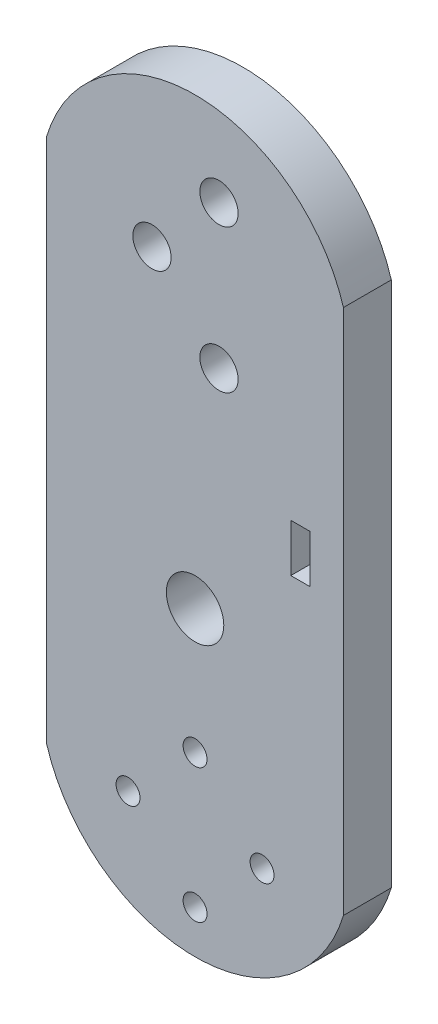
ISO-10303-21;
HEADER;
FILE_DESCRIPTION(('STEP AP214'),'2;1');
FILE_NAME('part.step','',(''),(''),'','','');
FILE_SCHEMA(('AUTOMOTIVE_DESIGN { 1 0 10303 214 1 1 1 1 }'));
ENDSEC;
DATA;
#1=APPLICATION_CONTEXT('core data for automotive mechanical design processes');
#2=APPLICATION_PROTOCOL_DEFINITION('international standard','automotive_design',2000,#1);
#3=PRODUCT_CONTEXT('',#1,'mechanical');
#4=PRODUCT('Part','Part','',(#3));
#5=PRODUCT_RELATED_PRODUCT_CATEGORY('part','',(#4));
#6=PRODUCT_DEFINITION_FORMATION('','',#4);
#7=PRODUCT_DEFINITION_CONTEXT('part definition',#1,'design');
#8=PRODUCT_DEFINITION('design','',#6,#7);
#9=PRODUCT_DEFINITION_SHAPE('','',#8);
#10=(LENGTH_UNIT() NAMED_UNIT(*) SI_UNIT(.MILLI.,.METRE.));
#11=(NAMED_UNIT(*) PLANE_ANGLE_UNIT() SI_UNIT($,.RADIAN.));
#12=(NAMED_UNIT(*) SI_UNIT($,.STERADIAN.) SOLID_ANGLE_UNIT());
#13=UNCERTAINTY_MEASURE_WITH_UNIT(LENGTH_MEASURE(1.E-05),#10,'distance_accuracy_value','');
#14=(GEOMETRIC_REPRESENTATION_CONTEXT(3) GLOBAL_UNCERTAINTY_ASSIGNED_CONTEXT((#13)) GLOBAL_UNIT_ASSIGNED_CONTEXT((#10,
#11,#12)) REPRESENTATION_CONTEXT('',''));
#15=CARTESIAN_POINT('',(0.,0.,0.));
#16=DIRECTION('',(0.,0.,1.));
#17=DIRECTION('',(1.,0.,0.));
#18=AXIS2_PLACEMENT_3D('',#15,#16,#17);
#19=CARTESIAN_POINT('',(0.,4.69565217391304,5.));
#20=DIRECTION('',(0.,0.,1.));
#21=DIRECTION('',(1.,0.,0.));
#22=AXIS2_PLACEMENT_3D('',#19,#20,#21);
#23=PLANE('',#22);
#24=CARTESIAN_POINT('',(2.49999999999999,43.,5.));
#25=DIRECTION('',(0.,0.,1.));
#26=DIRECTION('',(1.,0.,0.));
#27=AXIS2_PLACEMENT_3D('',#24,#25,#26);
#28=CIRCLE('',#27,2.);
#29=CARTESIAN_POINT('',(4.5,43.,5.));
#30=VERTEX_POINT('',#29);
#31=EDGE_CURVE('E169',#30,#30,#28,.T.);
#32=ORIENTED_EDGE('',*,*,#31,.F.);
#33=EDGE_LOOP('',(#32));
#34=FACE_BOUND('',#33,.T.);
#35=CARTESIAN_POINT('',(0.,20.,5.));
#36=DIRECTION('',(0.,0.,1.));
#37=DIRECTION('',(1.,0.,0.));
#38=AXIS2_PLACEMENT_3D('',#35,#36,#37);
#39=CIRCLE('',#38,3.);
#40=CARTESIAN_POINT('',(3.,20.,5.));
#41=VERTEX_POINT('',#40);
#42=EDGE_CURVE('E185',#41,#41,#39,.T.);
#43=ORIENTED_EDGE('',*,*,#42,.F.);
#44=EDGE_LOOP('',(#43));
#45=FACE_BOUND('',#44,.T.);
#46=CARTESIAN_POINT('',(0.,-7.,5.));
#47=DIRECTION('',(0.,0.,1.));
#48=DIRECTION('',(1.,0.,0.));
#49=AXIS2_PLACEMENT_3D('',#46,#47,#48);
#50=CIRCLE('',#49,1.25);
#51=CARTESIAN_POINT('',(1.25,-7.,5.));
#52=VERTEX_POINT('',#51);
#53=EDGE_CURVE('E201',#52,#52,#50,.T.);
#54=ORIENTED_EDGE('',*,*,#53,.F.);
#55=EDGE_LOOP('',(#54));
#56=FACE_BOUND('',#55,.T.);
#57=CARTESIAN_POINT('',(0.,7.,5.));
#58=DIRECTION('',(0.,0.,1.));
#59=DIRECTION('',(1.,0.,0.));
#60=AXIS2_PLACEMENT_3D('',#57,#58,#59);
#61=CIRCLE('',#60,1.25);
#62=CARTESIAN_POINT('',(1.25,7.,5.));
#63=VERTEX_POINT('',#62);
#64=EDGE_CURVE('E217',#63,#63,#61,.T.);
#65=ORIENTED_EDGE('',*,*,#64,.F.);
#66=EDGE_LOOP('',(#65));
#67=FACE_BOUND('',#66,.T.);
#68=CARTESIAN_POINT('',(0.,4.69565217391304,5.));
#69=DIRECTION('',(0.,0.,1.));
#70=DIRECTION('',(1.,0.,0.));
#71=AXIS2_PLACEMENT_3D('',#68,#69,#70);
#72=CIRCLE('',#71,16.195652173913);
#73=CARTESIAN_POINT('',(-15.5,0.,5.));
#74=VERTEX_POINT('',#73);
#75=CARTESIAN_POINT('',(15.5,0.,5.));
#76=VERTEX_POINT('',#75);
#77=EDGE_CURVE('E225',#74,#76,#72,.T.);
#78=ORIENTED_EDGE('',*,*,#77,.T.);
#79=DIRECTION('',(0.,1.,0.));
#80=VECTOR('',#79,1.);
#81=CARTESIAN_POINT('',(15.5,55.,5.));
#82=LINE('',#81,#80);
#83=CARTESIAN_POINT('',(15.5,55.,5.));
#84=VERTEX_POINT('',#83);
#85=EDGE_CURVE('E229',#76,#84,#82,.T.);
#86=ORIENTED_EDGE('',*,*,#85,.T.);
#87=CARTESIAN_POINT('',(0.,50.304347826087,5.));
#88=DIRECTION('',(0.,0.,1.));
#89=DIRECTION('',(-1.,0.,0.));
#90=AXIS2_PLACEMENT_3D('',#87,#88,#89);
#91=CIRCLE('',#90,16.195652173913);
#92=CARTESIAN_POINT('',(-15.5,55.,5.));
#93=VERTEX_POINT('',#92);
#94=EDGE_CURVE('E233',#84,#93,#91,.T.);
#95=ORIENTED_EDGE('',*,*,#94,.T.);
#96=DIRECTION('',(0.,-1.,0.));
#97=VECTOR('',#96,1.);
#98=CARTESIAN_POINT('',(-15.5,55.,5.));
#99=LINE('',#98,#97);
#100=EDGE_CURVE('E236',#93,#74,#99,.T.);
#101=ORIENTED_EDGE('',*,*,#100,.T.);
#102=EDGE_LOOP('',(#78,#86,#95,#101));
#103=FACE_BOUND('',#102,.T.);
#104=CARTESIAN_POINT('',(7.,0.,5.));
#105=DIRECTION('',(0.,0.,1.));
#106=DIRECTION('',(1.,0.,0.));
#107=AXIS2_PLACEMENT_3D('',#104,#105,#106);
#108=CIRCLE('',#107,1.25);
#109=CARTESIAN_POINT('',(8.25,0.,5.));
#110=VERTEX_POINT('',#109);
#111=EDGE_CURVE('E209',#110,#110,#108,.T.);
#112=ORIENTED_EDGE('',*,*,#111,.F.);
#113=EDGE_LOOP('',(#112));
#114=FACE_BOUND('',#113,.T.);
#115=CARTESIAN_POINT('',(-7.,0.,5.));
#116=DIRECTION('',(0.,0.,1.));
#117=DIRECTION('',(1.,0.,0.));
#118=AXIS2_PLACEMENT_3D('',#115,#116,#117);
#119=CIRCLE('',#118,1.25);
#120=CARTESIAN_POINT('',(-5.75,0.,5.));
#121=VERTEX_POINT('',#120);
#122=EDGE_CURVE('E193',#121,#121,#119,.T.);
#123=ORIENTED_EDGE('',*,*,#122,.F.);
#124=EDGE_LOOP('',(#123));
#125=FACE_BOUND('',#124,.T.);
#126=CARTESIAN_POINT('',(2.49999999999999,58.,5.));
#127=DIRECTION('',(0.,0.,1.));
#128=DIRECTION('',(1.,0.,0.));
#129=AXIS2_PLACEMENT_3D('',#126,#127,#128);
#130=CIRCLE('',#129,2.);
#131=CARTESIAN_POINT('',(4.5,58.,5.));
#132=VERTEX_POINT('',#131);
#133=EDGE_CURVE('E177',#132,#132,#130,.T.);
#134=ORIENTED_EDGE('',*,*,#133,.F.);
#135=EDGE_LOOP('',(#134));
#136=FACE_BOUND('',#135,.T.);
#137=CARTESIAN_POINT('',(-4.50000000000001,50.5,5.));
#138=DIRECTION('',(0.,0.,1.));
#139=DIRECTION('',(1.,0.,0.));
#140=AXIS2_PLACEMENT_3D('',#137,#138,#139);
#141=CIRCLE('',#140,2.);
#142=CARTESIAN_POINT('',(-2.5,50.5,5.));
#143=VERTEX_POINT('',#142);
#144=EDGE_CURVE('E161',#143,#143,#141,.T.);
#145=ORIENTED_EDGE('',*,*,#144,.F.);
#146=EDGE_LOOP('',(#145));
#147=FACE_BOUND('',#146,.T.);
#148=DIRECTION('',(1.,0.,0.));
#149=VECTOR('',#148,1.);
#150=CARTESIAN_POINT('',(9.99999999999999,28.,5.));
#151=LINE('',#150,#149);
#152=CARTESIAN_POINT('',(9.99999999999999,28.,5.));
#153=VERTEX_POINT('',#152);
#154=CARTESIAN_POINT('',(12.,28.,5.));
#155=VERTEX_POINT('',#154);
#156=EDGE_CURVE('E120',#153,#155,#151,.T.);
#157=ORIENTED_EDGE('',*,*,#156,.F.);
#158=DIRECTION('',(0.,-1.,0.));
#159=VECTOR('',#158,1.);
#160=CARTESIAN_POINT('',(9.99999999999999,33.,5.));
#161=LINE('',#160,#159);
#162=CARTESIAN_POINT('',(9.99999999999999,33.,5.));
#163=VERTEX_POINT('',#162);
#164=EDGE_CURVE('E111',#163,#153,#161,.T.);
#165=ORIENTED_EDGE('',*,*,#164,.F.);
#166=DIRECTION('',(-1.,0.,0.));
#167=VECTOR('',#166,1.);
#168=CARTESIAN_POINT('',(9.99999999999999,33.,5.));
#169=LINE('',#168,#167);
#170=CARTESIAN_POINT('',(12.,33.,5.));
#171=VERTEX_POINT('',#170);
#172=EDGE_CURVE('E139',#171,#163,#169,.T.);
#173=ORIENTED_EDGE('',*,*,#172,.F.);
#174=DIRECTION('',(0.,1.,0.));
#175=VECTOR('',#174,1.);
#176=CARTESIAN_POINT('',(12.,33.,5.));
#177=LINE('',#176,#175);
#178=EDGE_CURVE('E133',#155,#171,#177,.T.);
#179=ORIENTED_EDGE('',*,*,#178,.F.);
#180=EDGE_LOOP('',(#157,#165,#173,#179));
#181=FACE_BOUND('',#180,.T.);
#182=ADVANCED_FACE('F45',(#34,#45,#56,#67,#103,#114,#125,#136,#147,#181),#23,.T.);
#183=CARTESIAN_POINT('',(0.,4.69565217391304,0.));
#184=DIRECTION('',(0.,0.,1.));
#185=DIRECTION('',(1.,0.,0.));
#186=AXIS2_PLACEMENT_3D('',#183,#184,#185);
#187=PLANE('',#186);
#188=CARTESIAN_POINT('',(-4.50000000000001,50.5,0.));
#189=DIRECTION('',(0.,0.,1.));
#190=DIRECTION('',(1.,0.,0.));
#191=AXIS2_PLACEMENT_3D('',#188,#189,#190);
#192=CIRCLE('',#191,2.);
#193=CARTESIAN_POINT('',(-2.5,50.5,0.));
#194=VERTEX_POINT('',#193);
#195=EDGE_CURVE('E129',#194,#194,#192,.T.);
#196=ORIENTED_EDGE('',*,*,#195,.T.);
#197=EDGE_LOOP('',(#196));
#198=FACE_BOUND('',#197,.T.);
#199=CARTESIAN_POINT('',(2.49999999999999,43.,0.));
#200=DIRECTION('',(0.,0.,1.));
#201=DIRECTION('',(1.,0.,0.));
#202=AXIS2_PLACEMENT_3D('',#199,#200,#201);
#203=CIRCLE('',#202,2.);
#204=CARTESIAN_POINT('',(4.5,43.,0.));
#205=VERTEX_POINT('',#204);
#206=EDGE_CURVE('E165',#205,#205,#203,.T.);
#207=ORIENTED_EDGE('',*,*,#206,.T.);
#208=EDGE_LOOP('',(#207));
#209=FACE_BOUND('',#208,.T.);
#210=CARTESIAN_POINT('',(2.49999999999999,58.,0.));
#211=DIRECTION('',(0.,0.,1.));
#212=DIRECTION('',(1.,0.,0.));
#213=AXIS2_PLACEMENT_3D('',#210,#211,#212);
#214=CIRCLE('',#213,2.);
#215=CARTESIAN_POINT('',(4.5,58.,0.));
#216=VERTEX_POINT('',#215);
#217=EDGE_CURVE('E173',#216,#216,#214,.T.);
#218=ORIENTED_EDGE('',*,*,#217,.T.);
#219=EDGE_LOOP('',(#218));
#220=FACE_BOUND('',#219,.T.);
#221=CARTESIAN_POINT('',(0.,20.,0.));
#222=DIRECTION('',(0.,0.,1.));
#223=DIRECTION('',(1.,0.,0.));
#224=AXIS2_PLACEMENT_3D('',#221,#222,#223);
#225=CIRCLE('',#224,3.);
#226=CARTESIAN_POINT('',(3.,20.,0.));
#227=VERTEX_POINT('',#226);
#228=EDGE_CURVE('E181',#227,#227,#225,.T.);
#229=ORIENTED_EDGE('',*,*,#228,.T.);
#230=EDGE_LOOP('',(#229));
#231=FACE_BOUND('',#230,.T.);
#232=CARTESIAN_POINT('',(-7.,0.,0.));
#233=DIRECTION('',(0.,0.,1.));
#234=DIRECTION('',(1.,0.,0.));
#235=AXIS2_PLACEMENT_3D('',#232,#233,#234);
#236=CIRCLE('',#235,1.25);
#237=CARTESIAN_POINT('',(-5.75,0.,0.));
#238=VERTEX_POINT('',#237);
#239=EDGE_CURVE('E189',#238,#238,#236,.T.);
#240=ORIENTED_EDGE('',*,*,#239,.T.);
#241=EDGE_LOOP('',(#240));
#242=FACE_BOUND('',#241,.T.);
#243=CARTESIAN_POINT('',(0.,-7.,0.));
#244=DIRECTION('',(0.,0.,1.));
#245=DIRECTION('',(1.,0.,0.));
#246=AXIS2_PLACEMENT_3D('',#243,#244,#245);
#247=CIRCLE('',#246,1.25);
#248=CARTESIAN_POINT('',(1.25,-7.,0.));
#249=VERTEX_POINT('',#248);
#250=EDGE_CURVE('E197',#249,#249,#247,.T.);
#251=ORIENTED_EDGE('',*,*,#250,.T.);
#252=EDGE_LOOP('',(#251));
#253=FACE_BOUND('',#252,.T.);
#254=CARTESIAN_POINT('',(7.,0.,0.));
#255=DIRECTION('',(0.,0.,1.));
#256=DIRECTION('',(1.,0.,0.));
#257=AXIS2_PLACEMENT_3D('',#254,#255,#256);
#258=CIRCLE('',#257,1.25);
#259=CARTESIAN_POINT('',(8.25,0.,0.));
#260=VERTEX_POINT('',#259);
#261=EDGE_CURVE('E205',#260,#260,#258,.T.);
#262=ORIENTED_EDGE('',*,*,#261,.T.);
#263=EDGE_LOOP('',(#262));
#264=FACE_BOUND('',#263,.T.);
#265=CARTESIAN_POINT('',(0.,7.,0.));
#266=DIRECTION('',(0.,0.,1.));
#267=DIRECTION('',(1.,0.,0.));
#268=AXIS2_PLACEMENT_3D('',#265,#266,#267);
#269=CIRCLE('',#268,1.25);
#270=CARTESIAN_POINT('',(1.25,7.,0.));
#271=VERTEX_POINT('',#270);
#272=EDGE_CURVE('E213',#271,#271,#269,.T.);
#273=ORIENTED_EDGE('',*,*,#272,.T.);
#274=EDGE_LOOP('',(#273));
#275=FACE_BOUND('',#274,.T.);
#276=CARTESIAN_POINT('',(0.,4.69565217391304,0.));
#277=DIRECTION('',(0.,0.,1.));
#278=DIRECTION('',(1.,0.,0.));
#279=AXIS2_PLACEMENT_3D('',#276,#277,#278);
#280=CIRCLE('',#279,16.195652173913);
#281=CARTESIAN_POINT('',(-15.5,0.,0.));
#282=VERTEX_POINT('',#281);
#283=CARTESIAN_POINT('',(15.5,0.,0.));
#284=VERTEX_POINT('',#283);
#285=EDGE_CURVE('E221',#282,#284,#280,.T.);
#286=ORIENTED_EDGE('',*,*,#285,.F.);
#287=DIRECTION('',(0.,-1.,0.));
#288=VECTOR('',#287,1.);
#289=CARTESIAN_POINT('',(-15.5,55.,0.));
#290=LINE('',#289,#288);
#291=CARTESIAN_POINT('',(-15.5,55.,0.));
#292=VERTEX_POINT('',#291);
#293=EDGE_CURVE('E230',#292,#282,#290,.T.);
#294=ORIENTED_EDGE('',*,*,#293,.F.);
#295=CARTESIAN_POINT('',(0.,50.304347826087,0.));
#296=DIRECTION('',(0.,0.,1.));
#297=DIRECTION('',(-1.,0.,0.));
#298=AXIS2_PLACEMENT_3D('',#295,#296,#297);
#299=CIRCLE('',#298,16.195652173913);
#300=CARTESIAN_POINT('',(15.5,55.,0.));
#301=VERTEX_POINT('',#300);
#302=EDGE_CURVE('E246',#301,#292,#299,.T.);
#303=ORIENTED_EDGE('',*,*,#302,.F.);
#304=DIRECTION('',(0.,1.,0.));
#305=VECTOR('',#304,1.);
#306=CARTESIAN_POINT('',(15.5,55.,0.));
#307=LINE('',#306,#305);
#308=EDGE_CURVE('E243',#284,#301,#307,.T.);
#309=ORIENTED_EDGE('',*,*,#308,.F.);
#310=EDGE_LOOP('',(#286,#294,#303,#309));
#311=FACE_BOUND('',#310,.T.);
#312=DIRECTION('',(0.,-1.,0.));
#313=VECTOR('',#312,1.);
#314=CARTESIAN_POINT('',(9.99999999999999,33.,0.));
#315=LINE('',#314,#313);
#316=CARTESIAN_POINT('',(9.99999999999999,33.,0.));
#317=VERTEX_POINT('',#316);
#318=CARTESIAN_POINT('',(9.99999999999999,28.,0.));
#319=VERTEX_POINT('',#318);
#320=EDGE_CURVE('E69',#317,#319,#315,.T.);
#321=ORIENTED_EDGE('',*,*,#320,.T.);
#322=DIRECTION('',(1.,0.,0.));
#323=VECTOR('',#322,1.);
#324=CARTESIAN_POINT('',(9.99999999999999,28.,0.));
#325=LINE('',#324,#323);
#326=CARTESIAN_POINT('',(12.,28.,0.));
#327=VERTEX_POINT('',#326);
#328=EDGE_CURVE('E127',#319,#327,#325,.T.);
#329=ORIENTED_EDGE('',*,*,#328,.T.);
#330=DIRECTION('',(0.,1.,0.));
#331=VECTOR('',#330,1.);
#332=CARTESIAN_POINT('',(12.,33.,0.));
#333=LINE('',#332,#331);
#334=CARTESIAN_POINT('',(12.,33.,0.));
#335=VERTEX_POINT('',#334);
#336=EDGE_CURVE('E148',#327,#335,#333,.T.);
#337=ORIENTED_EDGE('',*,*,#336,.T.);
#338=DIRECTION('',(-1.,0.,0.));
#339=VECTOR('',#338,1.);
#340=CARTESIAN_POINT('',(9.99999999999999,33.,0.));
#341=LINE('',#340,#339);
#342=EDGE_CURVE('E121',#335,#317,#341,.T.);
#343=ORIENTED_EDGE('',*,*,#342,.T.);
#344=EDGE_LOOP('',(#321,#329,#337,#343));
#345=FACE_BOUND('',#344,.T.);
#346=ADVANCED_FACE('F271',(#198,#209,#220,#231,#242,#253,#264,#275,#311,#345),#187,.F.);
#347=CARTESIAN_POINT('',(0.,4.69565217391304,5.));
#348=DIRECTION('',(0.,0.,-1.));
#349=DIRECTION('',(-1.,0.,0.));
#350=AXIS2_PLACEMENT_3D('',#347,#348,#349);
#351=CYLINDRICAL_SURFACE('',#350,16.195652173913);
#352=ORIENTED_EDGE('',*,*,#285,.T.);
#353=DIRECTION('',(0.,0.,-1.));
#354=VECTOR('',#353,1.);
#355=CARTESIAN_POINT('',(15.5,0.,5.));
#356=LINE('',#355,#354);
#357=EDGE_CURVE('E11',#76,#284,#356,.T.);
#358=ORIENTED_EDGE('',*,*,#357,.F.);
#359=ORIENTED_EDGE('',*,*,#77,.F.);
#360=DIRECTION('',(0.,0.,-1.));
#361=VECTOR('',#360,1.);
#362=CARTESIAN_POINT('',(-15.5,0.,5.));
#363=LINE('',#362,#361);
#364=EDGE_CURVE('E239',#74,#282,#363,.T.);
#365=ORIENTED_EDGE('',*,*,#364,.T.);
#366=EDGE_LOOP('',(#352,#358,#359,#365));
#367=FACE_BOUND('',#366,.T.);
#368=ADVANCED_FACE('F47',(#367),#351,.T.);
#369=CARTESIAN_POINT('',(15.5,55.,5.));
#370=DIRECTION('',(-1.,0.,0.));
#371=DIRECTION('',(0.,0.,1.));
#372=AXIS2_PLACEMENT_3D('',#369,#370,#371);
#373=PLANE('',#372);
#374=ORIENTED_EDGE('',*,*,#308,.T.);
#375=DIRECTION('',(0.,0.,-1.));
#376=VECTOR('',#375,1.);
#377=CARTESIAN_POINT('',(15.5,55.,5.));
#378=LINE('',#377,#376);
#379=EDGE_CURVE('E54',#84,#301,#378,.T.);
#380=ORIENTED_EDGE('',*,*,#379,.F.);
#381=ORIENTED_EDGE('',*,*,#85,.F.);
#382=ORIENTED_EDGE('',*,*,#357,.T.);
#383=EDGE_LOOP('',(#374,#380,#381,#382));
#384=FACE_BOUND('',#383,.T.);
#385=ADVANCED_FACE('F282',(#384),#373,.F.);
#386=CARTESIAN_POINT('',(0.,50.304347826087,5.));
#387=DIRECTION('',(0.,0.,-1.));
#388=DIRECTION('',(-1.,0.,0.));
#389=AXIS2_PLACEMENT_3D('',#386,#387,#388);
#390=CYLINDRICAL_SURFACE('',#389,16.195652173913);
#391=ORIENTED_EDGE('',*,*,#302,.T.);
#392=DIRECTION('',(0.,0.,-1.));
#393=VECTOR('',#392,1.);
#394=CARTESIAN_POINT('',(-15.5,55.,5.));
#395=LINE('',#394,#393);
#396=EDGE_CURVE('E254',#93,#292,#395,.T.);
#397=ORIENTED_EDGE('',*,*,#396,.F.);
#398=ORIENTED_EDGE('',*,*,#94,.F.);
#399=ORIENTED_EDGE('',*,*,#379,.T.);
#400=EDGE_LOOP('',(#391,#397,#398,#399));
#401=FACE_BOUND('',#400,.T.);
#402=ADVANCED_FACE('F265',(#401),#390,.T.);
#403=CARTESIAN_POINT('',(-15.5,55.,5.));
#404=DIRECTION('',(1.,0.,0.));
#405=DIRECTION('',(0.,0.,-1.));
#406=AXIS2_PLACEMENT_3D('',#403,#404,#405);
#407=PLANE('',#406);
#408=ORIENTED_EDGE('',*,*,#293,.T.);
#409=ORIENTED_EDGE('',*,*,#364,.F.);
#410=ORIENTED_EDGE('',*,*,#100,.F.);
#411=ORIENTED_EDGE('',*,*,#396,.T.);
#412=EDGE_LOOP('',(#408,#409,#410,#411));
#413=FACE_BOUND('',#412,.T.);
#414=ADVANCED_FACE('F275',(#413),#407,.F.);
#415=CARTESIAN_POINT('',(0.,7.,5.));
#416=DIRECTION('',(0.,0.,-1.));
#417=DIRECTION('',(-1.,0.,0.));
#418=AXIS2_PLACEMENT_3D('',#415,#416,#417);
#419=CYLINDRICAL_SURFACE('',#418,1.25);
#420=ORIENTED_EDGE('',*,*,#64,.T.);
#421=EDGE_LOOP('',(#420));
#422=FACE_BOUND('',#421,.T.);
#423=ORIENTED_EDGE('',*,*,#272,.F.);
#424=EDGE_LOOP('',(#423));
#425=FACE_BOUND('',#424,.T.);
#426=ADVANCED_FACE('F300',(#422,#425),#419,.F.);
#427=CARTESIAN_POINT('',(7.,0.,5.));
#428=DIRECTION('',(0.,0.,-1.));
#429=DIRECTION('',(-1.,0.,0.));
#430=AXIS2_PLACEMENT_3D('',#427,#428,#429);
#431=CYLINDRICAL_SURFACE('',#430,1.25);
#432=ORIENTED_EDGE('',*,*,#111,.T.);
#433=EDGE_LOOP('',(#432));
#434=FACE_BOUND('',#433,.T.);
#435=ORIENTED_EDGE('',*,*,#261,.F.);
#436=EDGE_LOOP('',(#435));
#437=FACE_BOUND('',#436,.T.);
#438=ADVANCED_FACE('F307',(#434,#437),#431,.F.);
#439=CARTESIAN_POINT('',(0.,-7.,5.));
#440=DIRECTION('',(0.,0.,-1.));
#441=DIRECTION('',(-1.,0.,0.));
#442=AXIS2_PLACEMENT_3D('',#439,#440,#441);
#443=CYLINDRICAL_SURFACE('',#442,1.25);
#444=ORIENTED_EDGE('',*,*,#53,.T.);
#445=EDGE_LOOP('',(#444));
#446=FACE_BOUND('',#445,.T.);
#447=ORIENTED_EDGE('',*,*,#250,.F.);
#448=EDGE_LOOP('',(#447));
#449=FACE_BOUND('',#448,.T.);
#450=ADVANCED_FACE('F312',(#446,#449),#443,.F.);
#451=CARTESIAN_POINT('',(-7.,0.,5.));
#452=DIRECTION('',(0.,0.,-1.));
#453=DIRECTION('',(-1.,0.,0.));
#454=AXIS2_PLACEMENT_3D('',#451,#452,#453);
#455=CYLINDRICAL_SURFACE('',#454,1.25);
#456=ORIENTED_EDGE('',*,*,#122,.T.);
#457=EDGE_LOOP('',(#456));
#458=FACE_BOUND('',#457,.T.);
#459=ORIENTED_EDGE('',*,*,#239,.F.);
#460=EDGE_LOOP('',(#459));
#461=FACE_BOUND('',#460,.T.);
#462=ADVANCED_FACE('F322',(#458,#461),#455,.F.);
#463=CARTESIAN_POINT('',(0.,20.,5.));
#464=DIRECTION('',(0.,0.,-1.));
#465=DIRECTION('',(-1.,0.,0.));
#466=AXIS2_PLACEMENT_3D('',#463,#464,#465);
#467=CYLINDRICAL_SURFACE('',#466,3.);
#468=ORIENTED_EDGE('',*,*,#42,.T.);
#469=EDGE_LOOP('',(#468));
#470=FACE_BOUND('',#469,.T.);
#471=ORIENTED_EDGE('',*,*,#228,.F.);
#472=EDGE_LOOP('',(#471));
#473=FACE_BOUND('',#472,.T.);
#474=ADVANCED_FACE('F329',(#470,#473),#467,.F.);
#475=CARTESIAN_POINT('',(2.49999999999999,58.,5.));
#476=DIRECTION('',(0.,0.,-1.));
#477=DIRECTION('',(-1.,0.,0.));
#478=AXIS2_PLACEMENT_3D('',#475,#476,#477);
#479=CYLINDRICAL_SURFACE('',#478,2.);
#480=ORIENTED_EDGE('',*,*,#133,.T.);
#481=EDGE_LOOP('',(#480));
#482=FACE_BOUND('',#481,.T.);
#483=ORIENTED_EDGE('',*,*,#217,.F.);
#484=EDGE_LOOP('',(#483));
#485=FACE_BOUND('',#484,.T.);
#486=ADVANCED_FACE('F333',(#482,#485),#479,.F.);
#487=CARTESIAN_POINT('',(2.49999999999999,43.,5.));
#488=DIRECTION('',(0.,0.,-1.));
#489=DIRECTION('',(-1.,0.,0.));
#490=AXIS2_PLACEMENT_3D('',#487,#488,#489);
#491=CYLINDRICAL_SURFACE('',#490,2.);
#492=ORIENTED_EDGE('',*,*,#31,.T.);
#493=EDGE_LOOP('',(#492));
#494=FACE_BOUND('',#493,.T.);
#495=ORIENTED_EDGE('',*,*,#206,.F.);
#496=EDGE_LOOP('',(#495));
#497=FACE_BOUND('',#496,.T.);
#498=ADVANCED_FACE('F337',(#494,#497),#491,.F.);
#499=CARTESIAN_POINT('',(-4.50000000000001,50.5,5.));
#500=DIRECTION('',(0.,0.,-1.));
#501=DIRECTION('',(-1.,0.,0.));
#502=AXIS2_PLACEMENT_3D('',#499,#500,#501);
#503=CYLINDRICAL_SURFACE('',#502,2.);
#504=ORIENTED_EDGE('',*,*,#144,.T.);
#505=EDGE_LOOP('',(#504));
#506=FACE_BOUND('',#505,.T.);
#507=ORIENTED_EDGE('',*,*,#195,.F.);
#508=EDGE_LOOP('',(#507));
#509=FACE_BOUND('',#508,.T.);
#510=ADVANCED_FACE('F341',(#506,#509),#503,.F.);
#511=CARTESIAN_POINT('',(9.99999999999999,33.,5.));
#512=DIRECTION('',(1.,0.,0.));
#513=DIRECTION('',(0.,0.,-1.));
#514=AXIS2_PLACEMENT_3D('',#511,#512,#513);
#515=PLANE('',#514);
#516=ORIENTED_EDGE('',*,*,#320,.F.);
#517=DIRECTION('',(0.,0.,-1.));
#518=VECTOR('',#517,1.);
#519=CARTESIAN_POINT('',(9.99999999999999,33.,5.));
#520=LINE('',#519,#518);
#521=EDGE_CURVE('E115',#163,#317,#520,.T.);
#522=ORIENTED_EDGE('',*,*,#521,.F.);
#523=ORIENTED_EDGE('',*,*,#164,.T.);
#524=DIRECTION('',(0.,0.,-1.));
#525=VECTOR('',#524,1.);
#526=CARTESIAN_POINT('',(9.99999999999999,28.,5.));
#527=LINE('',#526,#525);
#528=EDGE_CURVE('E114',#153,#319,#527,.T.);
#529=ORIENTED_EDGE('',*,*,#528,.T.);
#530=EDGE_LOOP('',(#516,#522,#523,#529));
#531=FACE_BOUND('',#530,.T.);
#532=ADVANCED_FACE('F113',(#531),#515,.T.);
#533=CARTESIAN_POINT('',(9.99999999999999,28.,5.));
#534=DIRECTION('',(0.,1.,0.));
#535=DIRECTION('',(0.,0.,1.));
#536=AXIS2_PLACEMENT_3D('',#533,#534,#535);
#537=PLANE('',#536);
#538=ORIENTED_EDGE('',*,*,#328,.F.);
#539=ORIENTED_EDGE('',*,*,#528,.F.);
#540=ORIENTED_EDGE('',*,*,#156,.T.);
#541=DIRECTION('',(0.,0.,-1.));
#542=VECTOR('',#541,1.);
#543=CARTESIAN_POINT('',(12.,28.,5.));
#544=LINE('',#543,#542);
#545=EDGE_CURVE('E130',#155,#327,#544,.T.);
#546=ORIENTED_EDGE('',*,*,#545,.T.);
#547=EDGE_LOOP('',(#538,#539,#540,#546));
#548=FACE_BOUND('',#547,.T.);
#549=ADVANCED_FACE('F124',(#548),#537,.T.);
#550=CARTESIAN_POINT('',(12.,33.,5.));
#551=DIRECTION('',(-1.,0.,0.));
#552=DIRECTION('',(0.,0.,1.));
#553=AXIS2_PLACEMENT_3D('',#550,#551,#552);
#554=PLANE('',#553);
#555=ORIENTED_EDGE('',*,*,#336,.F.);
#556=ORIENTED_EDGE('',*,*,#545,.F.);
#557=ORIENTED_EDGE('',*,*,#178,.T.);
#558=DIRECTION('',(0.,0.,-1.));
#559=VECTOR('',#558,1.);
#560=CARTESIAN_POINT('',(12.,33.,5.));
#561=LINE('',#560,#559);
#562=EDGE_CURVE('E61',#171,#335,#561,.T.);
#563=ORIENTED_EDGE('',*,*,#562,.T.);
#564=EDGE_LOOP('',(#555,#556,#557,#563));
#565=FACE_BOUND('',#564,.T.);
#566=ADVANCED_FACE('F350',(#565),#554,.T.);
#567=CARTESIAN_POINT('',(9.99999999999999,33.,5.));
#568=DIRECTION('',(0.,-1.,0.));
#569=DIRECTION('',(0.,0.,-1.));
#570=AXIS2_PLACEMENT_3D('',#567,#568,#569);
#571=PLANE('',#570);
#572=ORIENTED_EDGE('',*,*,#342,.F.);
#573=ORIENTED_EDGE('',*,*,#562,.F.);
#574=ORIENTED_EDGE('',*,*,#172,.T.);
#575=ORIENTED_EDGE('',*,*,#521,.T.);
#576=EDGE_LOOP('',(#572,#573,#574,#575));
#577=FACE_BOUND('',#576,.T.);
#578=ADVANCED_FACE('F353',(#577),#571,.T.);
#579=CLOSED_SHELL('',(#182,#346,#368,#385,#402,#414,#426,#438,#450,#462,#474,#486,#498,#510,
#532,#549,#566,#578));
#580=MANIFOLD_SOLID_BREP('B2',#579);
#581=ADVANCED_BREP_SHAPE_REPRESENTATION('',(#18,#580),#14);
#582=SHAPE_DEFINITION_REPRESENTATION(#9,#581);
ENDSEC;
END-ISO-10303-21;
